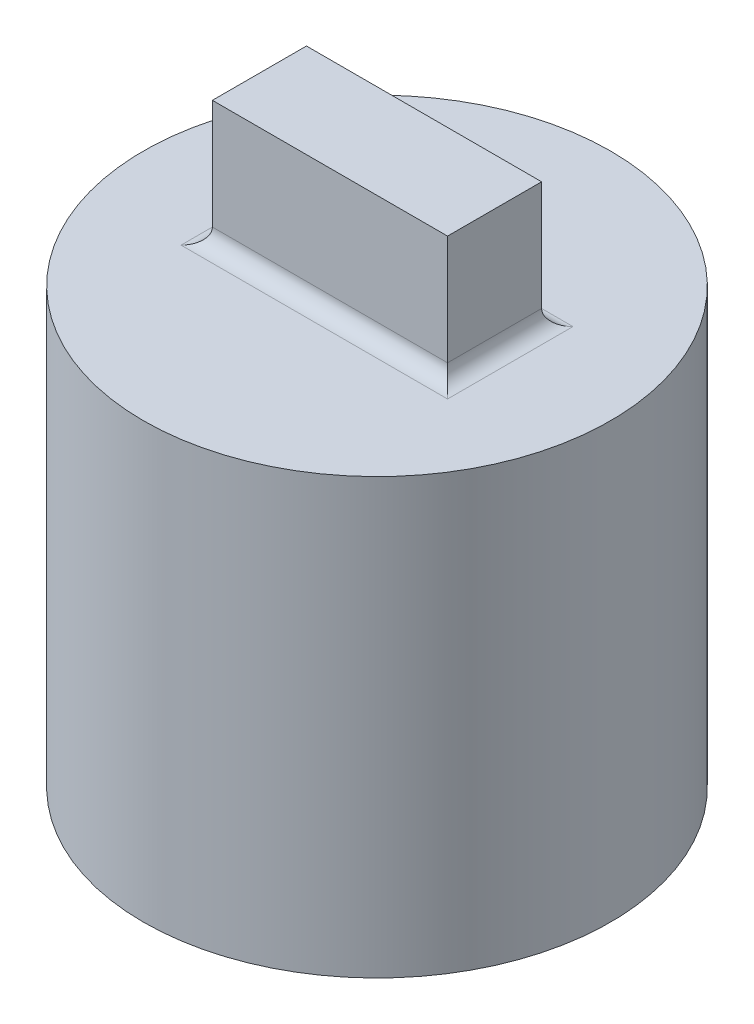
ISO-10303-21;
HEADER;
FILE_DESCRIPTION(('STEP AP214'),'2;1');
FILE_NAME('part.step','',(''),(''),'','','');
FILE_SCHEMA(('AUTOMOTIVE_DESIGN { 1 0 10303 214 1 1 1 1 }'));
ENDSEC;
DATA;
#1=APPLICATION_CONTEXT('core data for automotive mechanical design processes');
#2=APPLICATION_PROTOCOL_DEFINITION('international standard','automotive_design',2000,#1);
#3=PRODUCT_CONTEXT('',#1,'mechanical');
#4=PRODUCT('Part','Part','',(#3));
#5=PRODUCT_RELATED_PRODUCT_CATEGORY('part','',(#4));
#6=PRODUCT_DEFINITION_FORMATION('','',#4);
#7=PRODUCT_DEFINITION_CONTEXT('part definition',#1,'design');
#8=PRODUCT_DEFINITION('design','',#6,#7);
#9=PRODUCT_DEFINITION_SHAPE('','',#8);
#10=(LENGTH_UNIT() NAMED_UNIT(*) SI_UNIT(.MILLI.,.METRE.));
#11=(NAMED_UNIT(*) PLANE_ANGLE_UNIT() SI_UNIT($,.RADIAN.));
#12=(NAMED_UNIT(*) SI_UNIT($,.STERADIAN.) SOLID_ANGLE_UNIT());
#13=UNCERTAINTY_MEASURE_WITH_UNIT(LENGTH_MEASURE(1.E-05),#10,'distance_accuracy_value','');
#14=(GEOMETRIC_REPRESENTATION_CONTEXT(3) GLOBAL_UNCERTAINTY_ASSIGNED_CONTEXT((#13)) GLOBAL_UNIT_ASSIGNED_CONTEXT((#10,
#11,#12)) REPRESENTATION_CONTEXT('',''));
#15=CARTESIAN_POINT('',(0.,0.,0.));
#16=DIRECTION('',(0.,0.,1.));
#17=DIRECTION('',(1.,0.,0.));
#18=AXIS2_PLACEMENT_3D('',#15,#16,#17);
#19=CARTESIAN_POINT('',(0.,27.7,0.));
#20=DIRECTION('',(0.,1.,0.));
#21=DIRECTION('',(0.,0.,1.));
#22=AXIS2_PLACEMENT_3D('',#19,#20,#21);
#23=PLANE('',#22);
#24=DIRECTION('',(1.,0.,0.));
#25=VECTOR('',#24,1.);
#26=CARTESIAN_POINT('',(0.,27.7,-4.));
#27=LINE('',#26,#25);
#28=CARTESIAN_POINT('',(-8.5,27.7,-4.));
#29=VERTEX_POINT('',#28);
#30=CARTESIAN_POINT('',(8.5,27.7,-4.));
#31=VERTEX_POINT('',#30);
#32=EDGE_CURVE('E156',#29,#31,#27,.T.);
#33=ORIENTED_EDGE('',*,*,#32,.T.);
#34=DIRECTION('',(0.,0.,1.));
#35=VECTOR('',#34,1.);
#36=CARTESIAN_POINT('',(8.5,27.7,0.));
#37=LINE('',#36,#35);
#38=CARTESIAN_POINT('',(8.5,27.7,4.));
#39=VERTEX_POINT('',#38);
#40=EDGE_CURVE('E159',#31,#39,#37,.T.);
#41=ORIENTED_EDGE('',*,*,#40,.T.);
#42=DIRECTION('',(1.,0.,0.));
#43=VECTOR('',#42,1.);
#44=CARTESIAN_POINT('',(-7.5,27.7,4.));
#45=LINE('',#44,#43);
#46=CARTESIAN_POINT('',(-8.5,27.7,4.));
#47=VERTEX_POINT('',#46);
#48=EDGE_CURVE('E147',#39,#47,#45,.F.);
#49=ORIENTED_EDGE('',*,*,#48,.T.);
#50=DIRECTION('',(0.,0.,1.));
#51=VECTOR('',#50,1.);
#52=CARTESIAN_POINT('',(-8.5,27.7,-3.));
#53=LINE('',#52,#51);
#54=EDGE_CURVE('E153',#47,#29,#53,.F.);
#55=ORIENTED_EDGE('',*,*,#54,.T.);
#56=EDGE_LOOP('',(#33,#41,#49,#55));
#57=FACE_BOUND('',#56,.T.);
#58=CARTESIAN_POINT('',(0.,27.7,0.));
#59=DIRECTION('',(0.,1.,0.));
#60=DIRECTION('',(0.,0.,1.));
#61=AXIS2_PLACEMENT_3D('',#58,#59,#60);
#62=CIRCLE('',#61,14.9);
#63=CARTESIAN_POINT('',(0.,27.7,14.9));
#64=VERTEX_POINT('',#63);
#65=EDGE_CURVE('E143',#64,#64,#62,.T.);
#66=ORIENTED_EDGE('',*,*,#65,.T.);
#67=EDGE_LOOP('',(#66));
#68=FACE_BOUND('',#67,.T.);
#69=ADVANCED_FACE('F43',(#57,#68),#23,.T.);
#70=CARTESIAN_POINT('',(0.,27.7,0.));
#71=DIRECTION('',(0.,-1.,0.));
#72=DIRECTION('',(0.,0.,-1.));
#73=AXIS2_PLACEMENT_3D('',#70,#71,#72);
#74=CYLINDRICAL_SURFACE('',#73,14.9);
#75=ORIENTED_EDGE('',*,*,#65,.F.);
#76=EDGE_LOOP('',(#75));
#77=FACE_BOUND('',#76,.T.);
#78=CARTESIAN_POINT('',(0.,0.,0.));
#79=DIRECTION('',(0.,1.,0.));
#80=DIRECTION('',(0.,0.,1.));
#81=AXIS2_PLACEMENT_3D('',#78,#79,#80);
#82=CIRCLE('',#81,14.9);
#83=CARTESIAN_POINT('',(0.,0.,14.9));
#84=VERTEX_POINT('',#83);
#85=EDGE_CURVE('E139',#84,#84,#82,.T.);
#86=ORIENTED_EDGE('',*,*,#85,.T.);
#87=EDGE_LOOP('',(#86));
#88=FACE_BOUND('',#87,.T.);
#89=ADVANCED_FACE('F203',(#77,#88),#74,.T.);
#90=CARTESIAN_POINT('',(0.,0.,0.));
#91=DIRECTION('',(0.,1.,0.));
#92=DIRECTION('',(0.,0.,1.));
#93=AXIS2_PLACEMENT_3D('',#90,#91,#92);
#94=PLANE('',#93);
#95=CARTESIAN_POINT('',(0.,0.,0.));
#96=DIRECTION('',(0.,-1.,0.));
#97=DIRECTION('',(0.,0.,-1.));
#98=AXIS2_PLACEMENT_3D('',#95,#96,#97);
#99=CIRCLE('',#98,13.4);
#100=CARTESIAN_POINT('',(0.,0.,-13.4));
#101=VERTEX_POINT('',#100);
#102=EDGE_CURVE('E108',#101,#101,#99,.T.);
#103=ORIENTED_EDGE('',*,*,#102,.F.);
#104=EDGE_LOOP('',(#103));
#105=FACE_BOUND('',#104,.T.);
#106=ORIENTED_EDGE('',*,*,#85,.F.);
#107=EDGE_LOOP('',(#106));
#108=FACE_BOUND('',#107,.T.);
#109=ADVANCED_FACE('F209',(#105,#108),#94,.F.);
#110=CARTESIAN_POINT('',(0.,10.,0.));
#111=DIRECTION('',(0.,-1.,0.));
#112=DIRECTION('',(0.,0.,-1.));
#113=AXIS2_PLACEMENT_3D('',#110,#111,#112);
#114=CYLINDRICAL_SURFACE('',#113,13.4);
#115=CARTESIAN_POINT('',(0.,10.,0.));
#116=DIRECTION('',(0.,-1.,0.));
#117=DIRECTION('',(0.,0.,-1.));
#118=AXIS2_PLACEMENT_3D('',#115,#116,#117);
#119=CIRCLE('',#118,13.4);
#120=CARTESIAN_POINT('',(0.,10.,-13.4));
#121=VERTEX_POINT('',#120);
#122=EDGE_CURVE('E135',#121,#121,#119,.T.);
#123=ORIENTED_EDGE('',*,*,#122,.F.);
#124=EDGE_LOOP('',(#123));
#125=FACE_BOUND('',#124,.T.);
#126=ORIENTED_EDGE('',*,*,#102,.T.);
#127=EDGE_LOOP('',(#126));
#128=FACE_BOUND('',#127,.T.);
#129=ADVANCED_FACE('F214',(#125,#128),#114,.F.);
#130=CARTESIAN_POINT('',(0.,10.,0.));
#131=DIRECTION('',(0.,-1.,0.));
#132=DIRECTION('',(0.,0.,-1.));
#133=AXIS2_PLACEMENT_3D('',#130,#131,#132);
#134=PLANE('',#133);
#135=ORIENTED_EDGE('',*,*,#122,.T.);
#136=EDGE_LOOP('',(#135));
#137=FACE_BOUND('',#136,.T.);
#138=ADVANCED_FACE('F220',(#137),#134,.T.);
#139=CARTESIAN_POINT('',(7.5,35.7,-3.));
#140=DIRECTION('',(-1.,0.,0.));
#141=DIRECTION('',(0.,-1.,0.));
#142=AXIS2_PLACEMENT_3D('',#139,#140,#141);
#143=PLANE('',#142);
#144=DIRECTION('',(0.,-1.,0.));
#145=VECTOR('',#144,1.);
#146=CARTESIAN_POINT('',(7.5,35.7,3.));
#147=LINE('',#146,#145);
#148=CARTESIAN_POINT('',(7.5,35.7,3.));
#149=VERTEX_POINT('',#148);
#150=CARTESIAN_POINT('',(7.5,28.7,3.));
#151=VERTEX_POINT('',#150);
#152=EDGE_CURVE('E116',#149,#151,#147,.T.);
#153=ORIENTED_EDGE('',*,*,#152,.T.);
#154=DIRECTION('',(0.,0.,1.));
#155=VECTOR('',#154,1.);
#156=CARTESIAN_POINT('',(7.5,28.7,-3.));
#157=LINE('',#156,#155);
#158=CARTESIAN_POINT('',(7.5,28.7,-3.));
#159=VERTEX_POINT('',#158);
#160=EDGE_CURVE('E163',#151,#159,#157,.F.);
#161=ORIENTED_EDGE('',*,*,#160,.T.);
#162=DIRECTION('',(0.,-1.,0.));
#163=VECTOR('',#162,1.);
#164=CARTESIAN_POINT('',(7.5,35.7,-3.));
#165=LINE('',#164,#163);
#166=CARTESIAN_POINT('',(7.5,35.7,-3.));
#167=VERTEX_POINT('',#166);
#168=EDGE_CURVE('E118',#167,#159,#165,.T.);
#169=ORIENTED_EDGE('',*,*,#168,.F.);
#170=DIRECTION('',(0.,0.,1.));
#171=VECTOR('',#170,1.);
#172=CARTESIAN_POINT('',(7.5,35.7,-3.));
#173=LINE('',#172,#171);
#174=EDGE_CURVE('E109',#167,#149,#173,.T.);
#175=ORIENTED_EDGE('',*,*,#174,.T.);
#176=EDGE_LOOP('',(#153,#161,#169,#175));
#177=FACE_BOUND('',#176,.T.);
#178=ADVANCED_FACE('F195',(#177),#143,.F.);
#179=CARTESIAN_POINT('',(-7.5,35.7,-3.));
#180=DIRECTION('',(-1.,0.,0.));
#181=DIRECTION('',(0.,-1.,0.));
#182=AXIS2_PLACEMENT_3D('',#179,#180,#181);
#183=PLANE('',#182);
#184=DIRECTION('',(0.,-1.,0.));
#185=VECTOR('',#184,1.);
#186=CARTESIAN_POINT('',(-7.5,35.7,-3.));
#187=LINE('',#186,#185);
#188=CARTESIAN_POINT('',(-7.5,35.7,-3.));
#189=VERTEX_POINT('',#188);
#190=CARTESIAN_POINT('',(-7.5,28.7,-3.));
#191=VERTEX_POINT('',#190);
#192=EDGE_CURVE('E128',#189,#191,#187,.T.);
#193=ORIENTED_EDGE('',*,*,#192,.T.);
#194=DIRECTION('',(0.,0.,1.));
#195=VECTOR('',#194,1.);
#196=CARTESIAN_POINT('',(-7.5,28.7,3.));
#197=LINE('',#196,#195);
#198=CARTESIAN_POINT('',(-7.5,28.7,3.));
#199=VERTEX_POINT('',#198);
#200=EDGE_CURVE('E53',#191,#199,#197,.T.);
#201=ORIENTED_EDGE('',*,*,#200,.T.);
#202=DIRECTION('',(0.,-1.,0.));
#203=VECTOR('',#202,1.);
#204=CARTESIAN_POINT('',(-7.5,35.7,3.));
#205=LINE('',#204,#203);
#206=CARTESIAN_POINT('',(-7.5,35.7,3.));
#207=VERTEX_POINT('',#206);
#208=EDGE_CURVE('E113',#207,#199,#205,.T.);
#209=ORIENTED_EDGE('',*,*,#208,.F.);
#210=DIRECTION('',(0.,0.,1.));
#211=VECTOR('',#210,1.);
#212=CARTESIAN_POINT('',(-7.5,35.7,-3.));
#213=LINE('',#212,#211);
#214=EDGE_CURVE('E100',#189,#207,#213,.T.);
#215=ORIENTED_EDGE('',*,*,#214,.F.);
#216=EDGE_LOOP('',(#193,#201,#209,#215));
#217=FACE_BOUND('',#216,.T.);
#218=ADVANCED_FACE('F120',(#217),#183,.T.);
#219=CARTESIAN_POINT('',(7.5,35.7,-3.));
#220=DIRECTION('',(0.,1.,0.));
#221=DIRECTION('',(0.,0.,1.));
#222=AXIS2_PLACEMENT_3D('',#219,#220,#221);
#223=PLANE('',#222);
#224=ORIENTED_EDGE('',*,*,#214,.T.);
#225=DIRECTION('',(-1.,0.,0.));
#226=VECTOR('',#225,1.);
#227=CARTESIAN_POINT('',(7.5,35.7,3.));
#228=LINE('',#227,#226);
#229=EDGE_CURVE('E103',#149,#207,#228,.T.);
#230=ORIENTED_EDGE('',*,*,#229,.F.);
#231=ORIENTED_EDGE('',*,*,#174,.F.);
#232=DIRECTION('',(-1.,0.,0.));
#233=VECTOR('',#232,1.);
#234=CARTESIAN_POINT('',(7.5,35.7,-3.));
#235=LINE('',#234,#233);
#236=EDGE_CURVE('E106',#167,#189,#235,.T.);
#237=ORIENTED_EDGE('',*,*,#236,.T.);
#238=EDGE_LOOP('',(#224,#230,#231,#237));
#239=FACE_BOUND('',#238,.T.);
#240=ADVANCED_FACE('F102',(#239),#223,.T.);
#241=CARTESIAN_POINT('',(0.,0.,-3.));
#242=DIRECTION('',(0.,0.,1.));
#243=DIRECTION('',(1.,0.,0.));
#244=AXIS2_PLACEMENT_3D('',#241,#242,#243);
#245=PLANE('',#244);
#246=ORIENTED_EDGE('',*,*,#168,.T.);
#247=DIRECTION('',(1.,0.,0.));
#248=VECTOR('',#247,1.);
#249=CARTESIAN_POINT('',(0.,28.7,-3.));
#250=LINE('',#249,#248);
#251=EDGE_CURVE('E68',#159,#191,#250,.F.);
#252=ORIENTED_EDGE('',*,*,#251,.T.);
#253=ORIENTED_EDGE('',*,*,#192,.F.);
#254=ORIENTED_EDGE('',*,*,#236,.F.);
#255=EDGE_LOOP('',(#246,#252,#253,#254));
#256=FACE_BOUND('',#255,.T.);
#257=ADVANCED_FACE('F235',(#256),#245,.F.);
#258=CARTESIAN_POINT('',(0.,0.,3.));
#259=DIRECTION('',(0.,0.,1.));
#260=DIRECTION('',(1.,0.,0.));
#261=AXIS2_PLACEMENT_3D('',#258,#259,#260);
#262=PLANE('',#261);
#263=ORIENTED_EDGE('',*,*,#208,.T.);
#264=DIRECTION('',(1.,0.,0.));
#265=VECTOR('',#264,1.);
#266=CARTESIAN_POINT('',(7.5,28.7,3.));
#267=LINE('',#266,#265);
#268=EDGE_CURVE('E11',#199,#151,#267,.T.);
#269=ORIENTED_EDGE('',*,*,#268,.T.);
#270=ORIENTED_EDGE('',*,*,#152,.F.);
#271=ORIENTED_EDGE('',*,*,#229,.T.);
#272=EDGE_LOOP('',(#263,#269,#270,#271));
#273=FACE_BOUND('',#272,.T.);
#274=ADVANCED_FACE('F112',(#273),#262,.T.);
#275=CARTESIAN_POINT('',(-8.5,28.7,-3.));
#276=DIRECTION('',(0.,0.,-1.));
#277=DIRECTION('',(-1.,0.,0.));
#278=AXIS2_PLACEMENT_3D('',#275,#276,#277);
#279=CYLINDRICAL_SURFACE('',#278,1.);
#280=CARTESIAN_POINT('',(-8.5,28.7,4.));
#281=DIRECTION('',(-0.707106781186547,0.,-0.707106781186547));
#282=DIRECTION('',(-0.707106781186547,0.,0.707106781186547));
#283=AXIS2_PLACEMENT_3D('',#280,#281,#282);
#284=ELLIPSE('',#283,1.41421356237309,1.);
#285=EDGE_CURVE('E176',#199,#47,#284,.T.);
#286=ORIENTED_EDGE('',*,*,#285,.F.);
#287=ORIENTED_EDGE('',*,*,#200,.F.);
#288=CARTESIAN_POINT('',(-8.5,28.7,-4.));
#289=DIRECTION('',(0.707106781186547,0.,-0.707106781186547));
#290=DIRECTION('',(-0.707106781186547,0.,-0.707106781186547));
#291=AXIS2_PLACEMENT_3D('',#288,#289,#290);
#292=ELLIPSE('',#291,1.41421356237309,1.);
#293=EDGE_CURVE('E47',#29,#191,#292,.F.);
#294=ORIENTED_EDGE('',*,*,#293,.F.);
#295=ORIENTED_EDGE('',*,*,#54,.F.);
#296=EDGE_LOOP('',(#286,#287,#294,#295));
#297=FACE_BOUND('',#296,.T.);
#298=ADVANCED_FACE('F45',(#297),#279,.F.);
#299=CARTESIAN_POINT('',(0.,28.7,-4.));
#300=DIRECTION('',(1.,0.,0.));
#301=DIRECTION('',(0.,0.,-1.));
#302=AXIS2_PLACEMENT_3D('',#299,#300,#301);
#303=CYLINDRICAL_SURFACE('',#302,1.);
#304=ORIENTED_EDGE('',*,*,#293,.T.);
#305=ORIENTED_EDGE('',*,*,#251,.F.);
#306=CARTESIAN_POINT('',(8.5,28.7,-4.));
#307=DIRECTION('',(0.707106781186547,0.,0.707106781186547));
#308=DIRECTION('',(0.707106781186547,0.,-0.707106781186547));
#309=AXIS2_PLACEMENT_3D('',#306,#307,#308);
#310=ELLIPSE('',#309,1.41421356237309,1.);
#311=EDGE_CURVE('E174',#31,#159,#310,.F.);
#312=ORIENTED_EDGE('',*,*,#311,.F.);
#313=ORIENTED_EDGE('',*,*,#32,.F.);
#314=EDGE_LOOP('',(#304,#305,#312,#313));
#315=FACE_BOUND('',#314,.T.);
#316=ADVANCED_FACE('F187',(#315),#303,.F.);
#317=CARTESIAN_POINT('',(0.,28.7,4.));
#318=DIRECTION('',(-1.,0.,0.));
#319=DIRECTION('',(0.,0.,1.));
#320=AXIS2_PLACEMENT_3D('',#317,#318,#319);
#321=CYLINDRICAL_SURFACE('',#320,1.);
#322=ORIENTED_EDGE('',*,*,#285,.T.);
#323=ORIENTED_EDGE('',*,*,#48,.F.);
#324=CARTESIAN_POINT('',(8.5,28.7,4.));
#325=DIRECTION('',(-0.707106781186547,0.,0.707106781186547));
#326=DIRECTION('',(-0.707106781186547,0.,-0.707106781186547));
#327=AXIS2_PLACEMENT_3D('',#324,#325,#326);
#328=ELLIPSE('',#327,1.41421356237309,1.);
#329=EDGE_CURVE('E171',#151,#39,#328,.T.);
#330=ORIENTED_EDGE('',*,*,#329,.F.);
#331=ORIENTED_EDGE('',*,*,#268,.F.);
#332=EDGE_LOOP('',(#322,#323,#330,#331));
#333=FACE_BOUND('',#332,.T.);
#334=ADVANCED_FACE('F192',(#333),#321,.F.);
#335=CARTESIAN_POINT('',(8.5,28.7,0.));
#336=DIRECTION('',(0.,0.,1.));
#337=DIRECTION('',(1.,0.,0.));
#338=AXIS2_PLACEMENT_3D('',#335,#336,#337);
#339=CYLINDRICAL_SURFACE('',#338,1.);
#340=ORIENTED_EDGE('',*,*,#311,.T.);
#341=ORIENTED_EDGE('',*,*,#160,.F.);
#342=ORIENTED_EDGE('',*,*,#329,.T.);
#343=ORIENTED_EDGE('',*,*,#40,.F.);
#344=EDGE_LOOP('',(#340,#341,#342,#343));
#345=FACE_BOUND('',#344,.T.);
#346=ADVANCED_FACE('F198',(#345),#339,.F.);
#347=CLOSED_SHELL('',(#69,#89,#109,#129,#138,#178,#218,#240,#257,#274,#298,#316,#334,#346));
#348=MANIFOLD_SOLID_BREP('B2',#347);
#349=ADVANCED_BREP_SHAPE_REPRESENTATION('',(#18,#348),#14);
#350=SHAPE_DEFINITION_REPRESENTATION(#9,#349);
ENDSEC;
END-ISO-10303-21;
